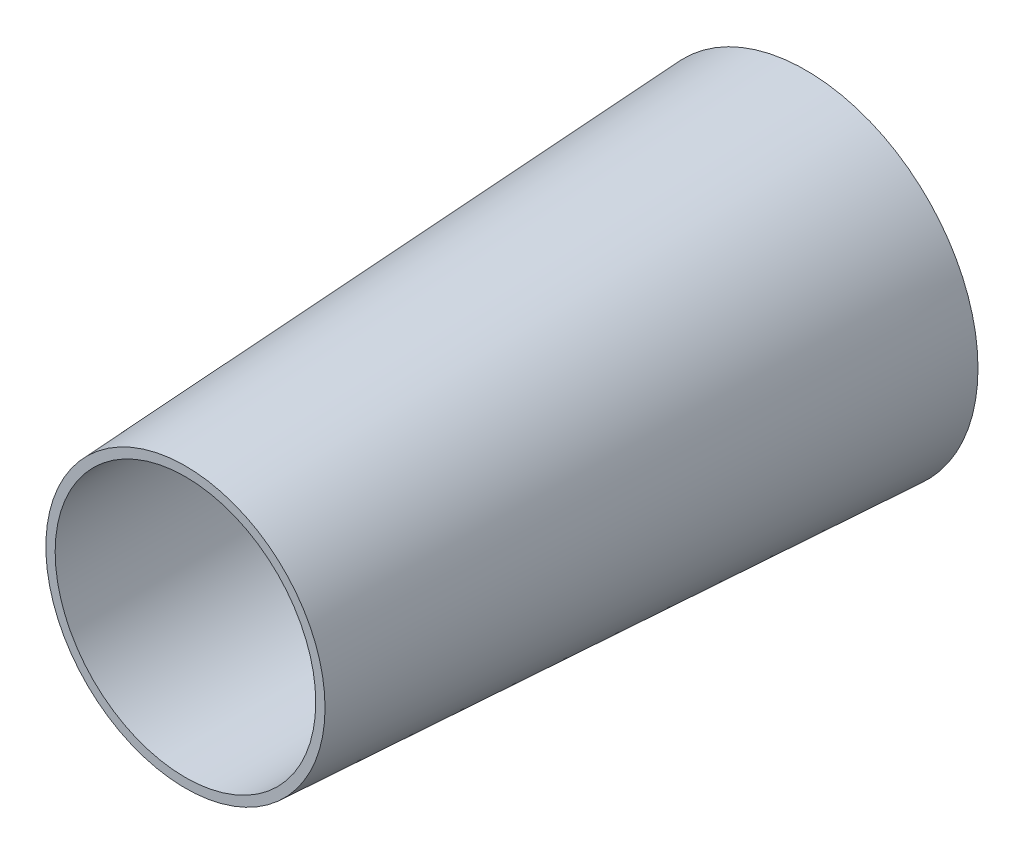
ISO-10303-21;
HEADER;
FILE_DESCRIPTION(('STEP AP214'),'2;1');
FILE_NAME('part.step','',(''),(''),'','','');
FILE_SCHEMA(('AUTOMOTIVE_DESIGN { 1 0 10303 214 1 1 1 1 }'));
ENDSEC;
DATA;
#1=APPLICATION_CONTEXT('core data for automotive mechanical design processes');
#2=APPLICATION_PROTOCOL_DEFINITION('international standard','automotive_design',2000,#1);
#3=PRODUCT_CONTEXT('',#1,'mechanical');
#4=PRODUCT('Part','Part','',(#3));
#5=PRODUCT_RELATED_PRODUCT_CATEGORY('part','',(#4));
#6=PRODUCT_DEFINITION_FORMATION('','',#4);
#7=PRODUCT_DEFINITION_CONTEXT('part definition',#1,'design');
#8=PRODUCT_DEFINITION('design','',#6,#7);
#9=PRODUCT_DEFINITION_SHAPE('','',#8);
#10=(LENGTH_UNIT() NAMED_UNIT(*) SI_UNIT(.MILLI.,.METRE.));
#11=(NAMED_UNIT(*) PLANE_ANGLE_UNIT() SI_UNIT($,.RADIAN.));
#12=(NAMED_UNIT(*) SI_UNIT($,.STERADIAN.) SOLID_ANGLE_UNIT());
#13=UNCERTAINTY_MEASURE_WITH_UNIT(LENGTH_MEASURE(1.E-05),#10,'distance_accuracy_value','');
#14=(GEOMETRIC_REPRESENTATION_CONTEXT(3) GLOBAL_UNCERTAINTY_ASSIGNED_CONTEXT((#13)) GLOBAL_UNIT_ASSIGNED_CONTEXT((#10,
#11,#12)) REPRESENTATION_CONTEXT('',''));
#15=CARTESIAN_POINT('',(0.,0.,0.));
#16=DIRECTION('',(0.,0.,1.));
#17=DIRECTION('',(1.,0.,0.));
#18=AXIS2_PLACEMENT_3D('',#15,#16,#17);
#19=CARTESIAN_POINT('',(0.,0.,100.));
#20=DIRECTION('',(0.,0.,-1.));
#21=DIRECTION('',(1.,0.,0.));
#22=AXIS2_PLACEMENT_3D('',#19,#20,#21);
#23=CONICAL_SURFACE('',#22,22.5,0.05235987755983);
#24=CARTESIAN_POINT('',(0.,0.,100.));
#25=DIRECTION('',(0.,0.,1.));
#26=DIRECTION('',(1.,0.,0.));
#27=AXIS2_PLACEMENT_3D('',#24,#25,#26);
#28=CIRCLE('',#27,22.5);
#29=CARTESIAN_POINT('',(22.5,0.,100.));
#30=VERTEX_POINT('',#29);
#31=EDGE_CURVE('E10',#30,#30,#28,.T.);
#32=ORIENTED_EDGE('',*,*,#31,.F.);
#33=EDGE_LOOP('',(#32));
#34=FACE_BOUND('',#33,.T.);
#35=CARTESIAN_POINT('',(0.,0.,0.));
#36=DIRECTION('',(0.,0.,1.));
#37=DIRECTION('',(1.,0.,0.));
#38=AXIS2_PLACEMENT_3D('',#35,#36,#37);
#39=CIRCLE('',#38,27.7407779283041);
#40=CARTESIAN_POINT('',(27.7407779283041,0.,0.));
#41=VERTEX_POINT('',#40);
#42=EDGE_CURVE('E34',#41,#41,#39,.T.);
#43=ORIENTED_EDGE('',*,*,#42,.T.);
#44=EDGE_LOOP('',(#43));
#45=FACE_BOUND('',#44,.T.);
#46=ADVANCED_FACE('F31',(#34,#45),#23,.T.);
#47=CARTESIAN_POINT('',(0.,0.,100.));
#48=DIRECTION('',(0.,0.,1.));
#49=DIRECTION('',(1.,0.,0.));
#50=AXIS2_PLACEMENT_3D('',#47,#48,#49);
#51=PLANE('',#50);
#52=CARTESIAN_POINT('',(0.,0.,100.));
#53=DIRECTION('',(0.,0.,-1.));
#54=DIRECTION('',(-1.,0.,0.));
#55=AXIS2_PLACEMENT_3D('',#52,#53,#54);
#56=CIRCLE('',#55,21.);
#57=CARTESIAN_POINT('',(-21.,0.,100.));
#58=VERTEX_POINT('',#57);
#59=EDGE_CURVE('E41',#58,#58,#56,.T.);
#60=ORIENTED_EDGE('',*,*,#59,.T.);
#61=EDGE_LOOP('',(#60));
#62=FACE_BOUND('',#61,.T.);
#63=ORIENTED_EDGE('',*,*,#31,.T.);
#64=EDGE_LOOP('',(#63));
#65=FACE_BOUND('',#64,.T.);
#66=ADVANCED_FACE('F49',(#62,#65),#51,.T.);
#67=CARTESIAN_POINT('',(0.,0.,0.));
#68=DIRECTION('',(0.,0.,1.));
#69=DIRECTION('',(1.,0.,0.));
#70=AXIS2_PLACEMENT_3D('',#67,#68,#69);
#71=PLANE('',#70);
#72=CARTESIAN_POINT('',(0.,0.,0.));
#73=DIRECTION('',(0.,0.,-1.));
#74=DIRECTION('',(-1.,0.,0.));
#75=AXIS2_PLACEMENT_3D('',#72,#73,#74);
#76=CIRCLE('',#75,21.);
#77=CARTESIAN_POINT('',(-21.,0.,0.));
#78=VERTEX_POINT('',#77);
#79=EDGE_CURVE('E43',#78,#78,#76,.T.);
#80=ORIENTED_EDGE('',*,*,#79,.F.);
#81=EDGE_LOOP('',(#80));
#82=FACE_BOUND('',#81,.T.);
#83=ORIENTED_EDGE('',*,*,#42,.F.);
#84=EDGE_LOOP('',(#83));
#85=FACE_BOUND('',#84,.T.);
#86=ADVANCED_FACE('F54',(#82,#85),#71,.F.);
#87=CARTESIAN_POINT('',(0.,0.,100.));
#88=DIRECTION('',(0.,0.,-1.));
#89=DIRECTION('',(-1.,0.,0.));
#90=AXIS2_PLACEMENT_3D('',#87,#88,#89);
#91=CYLINDRICAL_SURFACE('',#90,21.);
#92=ORIENTED_EDGE('',*,*,#59,.F.);
#93=EDGE_LOOP('',(#92));
#94=FACE_BOUND('',#93,.T.);
#95=ORIENTED_EDGE('',*,*,#79,.T.);
#96=EDGE_LOOP('',(#95));
#97=FACE_BOUND('',#96,.T.);
#98=ADVANCED_FACE('F51',(#94,#97),#91,.F.);
#99=CLOSED_SHELL('',(#46,#66,#86,#98));
#100=MANIFOLD_SOLID_BREP('B2',#99);
#101=ADVANCED_BREP_SHAPE_REPRESENTATION('',(#18,#100),#14);
#102=SHAPE_DEFINITION_REPRESENTATION(#9,#101);
ENDSEC;
END-ISO-10303-21;
